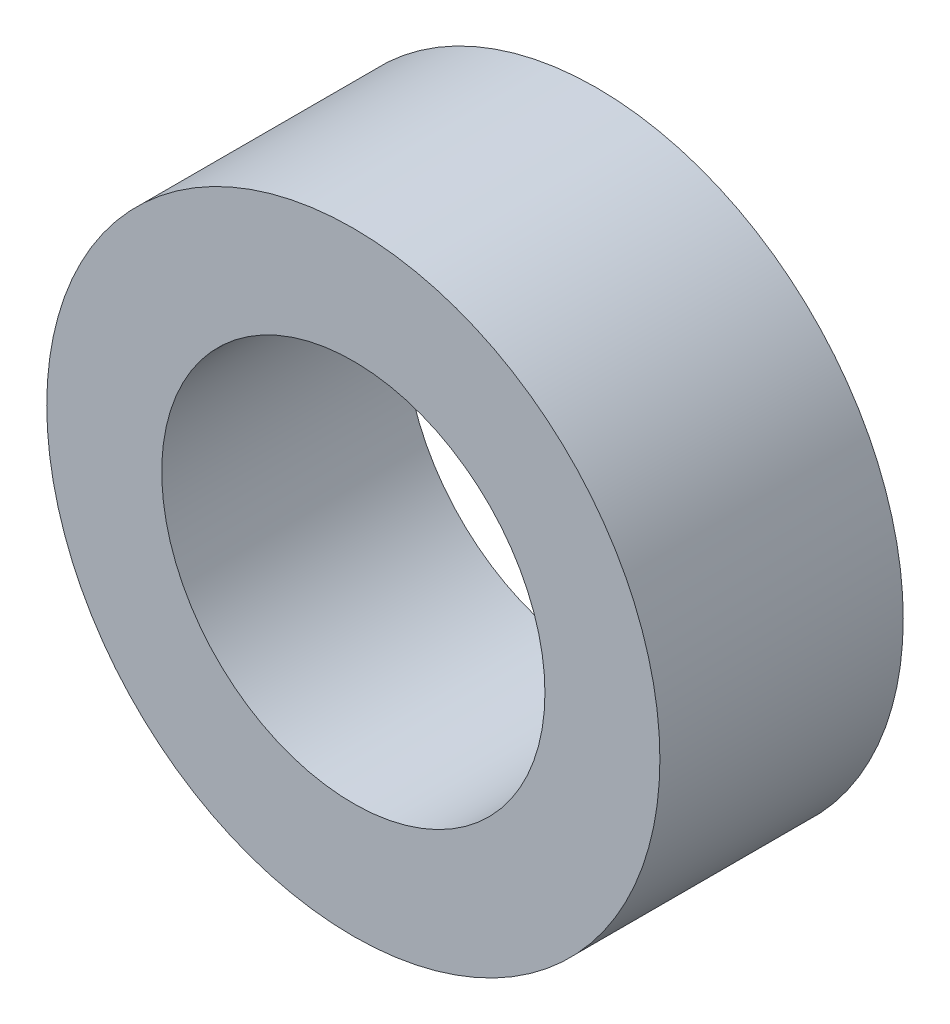
ISO-10303-21;
HEADER;
FILE_DESCRIPTION(('STEP AP214'),'2;1');
FILE_NAME('part.step','',(''),(''),'','','');
FILE_SCHEMA(('AUTOMOTIVE_DESIGN { 1 0 10303 214 1 1 1 1 }'));
ENDSEC;
DATA;
#1=APPLICATION_CONTEXT('core data for automotive mechanical design processes');
#2=APPLICATION_PROTOCOL_DEFINITION('international standard','automotive_design',2000,#1);
#3=PRODUCT_CONTEXT('',#1,'mechanical');
#4=PRODUCT('Part','Part','',(#3));
#5=PRODUCT_RELATED_PRODUCT_CATEGORY('part','',(#4));
#6=PRODUCT_DEFINITION_FORMATION('','',#4);
#7=PRODUCT_DEFINITION_CONTEXT('part definition',#1,'design');
#8=PRODUCT_DEFINITION('design','',#6,#7);
#9=PRODUCT_DEFINITION_SHAPE('','',#8);
#10=(LENGTH_UNIT() NAMED_UNIT(*) SI_UNIT(.MILLI.,.METRE.));
#11=(NAMED_UNIT(*) PLANE_ANGLE_UNIT() SI_UNIT($,.RADIAN.));
#12=(NAMED_UNIT(*) SI_UNIT($,.STERADIAN.) SOLID_ANGLE_UNIT());
#13=UNCERTAINTY_MEASURE_WITH_UNIT(LENGTH_MEASURE(1.E-05),#10,'distance_accuracy_value','');
#14=(GEOMETRIC_REPRESENTATION_CONTEXT(3) GLOBAL_UNCERTAINTY_ASSIGNED_CONTEXT((#13)) GLOBAL_UNIT_ASSIGNED_CONTEXT((#10,
#11,#12)) REPRESENTATION_CONTEXT('',''));
#15=CARTESIAN_POINT('',(0.,0.,0.));
#16=DIRECTION('',(0.,0.,1.));
#17=DIRECTION('',(1.,0.,0.));
#18=AXIS2_PLACEMENT_3D('',#15,#16,#17);
#19=CARTESIAN_POINT('',(0.,0.,3.175));
#20=DIRECTION('',(0.,0.,-1.));
#21=DIRECTION('',(-1.,0.,0.));
#22=AXIS2_PLACEMENT_3D('',#19,#20,#21);
#23=CYLINDRICAL_SURFACE('',#22,4.);
#24=CARTESIAN_POINT('',(0.,0.,3.175));
#25=DIRECTION('',(0.,0.,1.));
#26=DIRECTION('',(1.,0.,0.));
#27=AXIS2_PLACEMENT_3D('',#24,#25,#26);
#28=CIRCLE('',#27,4.);
#29=CARTESIAN_POINT('',(4.,0.,3.175));
#30=VERTEX_POINT('',#29);
#31=EDGE_CURVE('E10',#30,#30,#28,.T.);
#32=ORIENTED_EDGE('',*,*,#31,.F.);
#33=EDGE_LOOP('',(#32));
#34=FACE_BOUND('',#33,.T.);
#35=CARTESIAN_POINT('',(0.,0.,0.));
#36=DIRECTION('',(0.,0.,1.));
#37=DIRECTION('',(1.,0.,0.));
#38=AXIS2_PLACEMENT_3D('',#35,#36,#37);
#39=CIRCLE('',#38,4.);
#40=CARTESIAN_POINT('',(4.,0.,0.));
#41=VERTEX_POINT('',#40);
#42=EDGE_CURVE('E38',#41,#41,#39,.T.);
#43=ORIENTED_EDGE('',*,*,#42,.T.);
#44=EDGE_LOOP('',(#43));
#45=FACE_BOUND('',#44,.T.);
#46=ADVANCED_FACE('F35',(#34,#45),#23,.T.);
#47=CARTESIAN_POINT('',(0.,0.,3.175));
#48=DIRECTION('',(0.,0.,1.));
#49=DIRECTION('',(1.,0.,0.));
#50=AXIS2_PLACEMENT_3D('',#47,#48,#49);
#51=PLANE('',#50);
#52=CARTESIAN_POINT('',(0.,0.,3.175));
#53=DIRECTION('',(0.,0.,1.));
#54=DIRECTION('',(1.,0.,0.));
#55=AXIS2_PLACEMENT_3D('',#52,#53,#54);
#56=CIRCLE('',#55,2.5);
#57=CARTESIAN_POINT('',(2.5,0.,3.175));
#58=VERTEX_POINT('',#57);
#59=EDGE_CURVE('E47',#58,#58,#56,.T.);
#60=ORIENTED_EDGE('',*,*,#59,.F.);
#61=EDGE_LOOP('',(#60));
#62=FACE_BOUND('',#61,.T.);
#63=ORIENTED_EDGE('',*,*,#31,.T.);
#64=EDGE_LOOP('',(#63));
#65=FACE_BOUND('',#64,.T.);
#66=ADVANCED_FACE('F62',(#62,#65),#51,.T.);
#67=CARTESIAN_POINT('',(0.,0.,0.));
#68=DIRECTION('',(0.,0.,1.));
#69=DIRECTION('',(1.,0.,0.));
#70=AXIS2_PLACEMENT_3D('',#67,#68,#69);
#71=PLANE('',#70);
#72=CARTESIAN_POINT('',(0.,0.,0.));
#73=DIRECTION('',(0.,0.,1.));
#74=DIRECTION('',(1.,0.,0.));
#75=AXIS2_PLACEMENT_3D('',#72,#73,#74);
#76=CIRCLE('',#75,2.5);
#77=CARTESIAN_POINT('',(2.5,0.,0.));
#78=VERTEX_POINT('',#77);
#79=EDGE_CURVE('E45',#78,#78,#76,.T.);
#80=ORIENTED_EDGE('',*,*,#79,.T.);
#81=EDGE_LOOP('',(#80));
#82=FACE_BOUND('',#81,.T.);
#83=ORIENTED_EDGE('',*,*,#42,.F.);
#84=EDGE_LOOP('',(#83));
#85=FACE_BOUND('',#84,.T.);
#86=ADVANCED_FACE('F53',(#82,#85),#71,.F.);
#87=CARTESIAN_POINT('',(0.,0.,0.));
#88=DIRECTION('',(0.,0.,1.));
#89=DIRECTION('',(1.,0.,0.));
#90=AXIS2_PLACEMENT_3D('',#87,#88,#89);
#91=CYLINDRICAL_SURFACE('',#90,2.5);
#92=ORIENTED_EDGE('',*,*,#79,.F.);
#93=EDGE_LOOP('',(#92));
#94=FACE_BOUND('',#93,.T.);
#95=ORIENTED_EDGE('',*,*,#59,.T.);
#96=EDGE_LOOP('',(#95));
#97=FACE_BOUND('',#96,.T.);
#98=ADVANCED_FACE('F56',(#94,#97),#91,.F.);
#99=CLOSED_SHELL('',(#46,#66,#86,#98));
#100=MANIFOLD_SOLID_BREP('B2',#99);
#101=ADVANCED_BREP_SHAPE_REPRESENTATION('',(#18,#100),#14);
#102=SHAPE_DEFINITION_REPRESENTATION(#9,#101);
ENDSEC;
END-ISO-10303-21;
